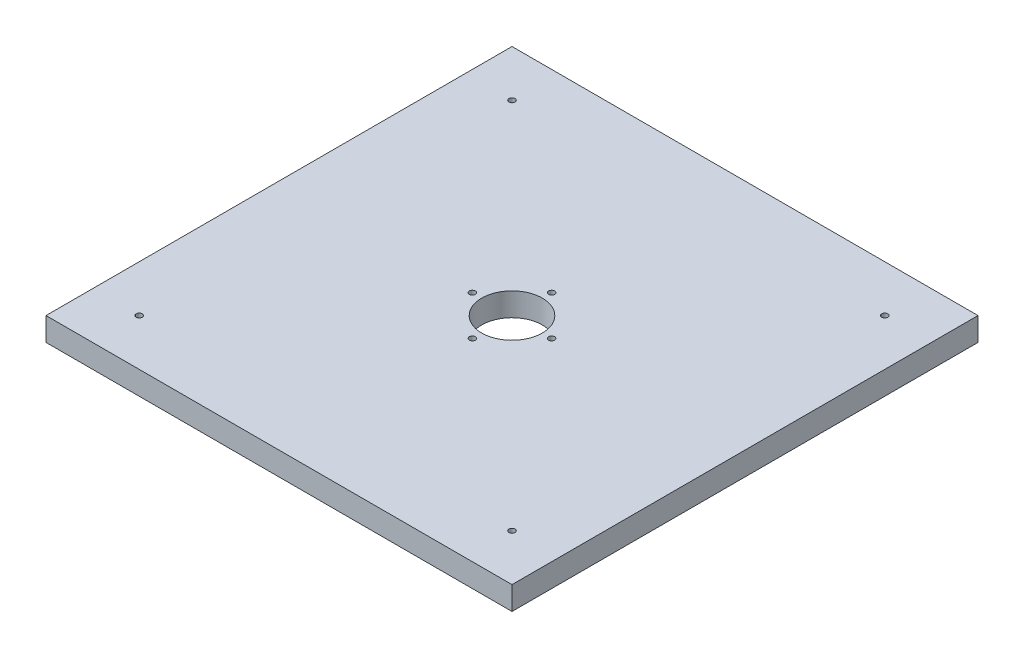
ISO-10303-21;
HEADER;
FILE_DESCRIPTION(('STEP AP214'),'2;1');
FILE_NAME('part.step','',(''),(''),'','','');
FILE_SCHEMA(('AUTOMOTIVE_DESIGN { 1 0 10303 214 1 1 1 1 }'));
ENDSEC;
DATA;
#1=APPLICATION_CONTEXT('core data for automotive mechanical design processes');
#2=APPLICATION_PROTOCOL_DEFINITION('international standard','automotive_design',2000,#1);
#3=PRODUCT_CONTEXT('',#1,'mechanical');
#4=PRODUCT('Part','Part','',(#3));
#5=PRODUCT_RELATED_PRODUCT_CATEGORY('part','',(#4));
#6=PRODUCT_DEFINITION_FORMATION('','',#4);
#7=PRODUCT_DEFINITION_CONTEXT('part definition',#1,'design');
#8=PRODUCT_DEFINITION('design','',#6,#7);
#9=PRODUCT_DEFINITION_SHAPE('','',#8);
#10=(LENGTH_UNIT() NAMED_UNIT(*) SI_UNIT(.MILLI.,.METRE.));
#11=(NAMED_UNIT(*) PLANE_ANGLE_UNIT() SI_UNIT($,.RADIAN.));
#12=(NAMED_UNIT(*) SI_UNIT($,.STERADIAN.) SOLID_ANGLE_UNIT());
#13=UNCERTAINTY_MEASURE_WITH_UNIT(LENGTH_MEASURE(1.E-05),#10,'distance_accuracy_value','');
#14=(GEOMETRIC_REPRESENTATION_CONTEXT(3) GLOBAL_UNCERTAINTY_ASSIGNED_CONTEXT((#13)) GLOBAL_UNIT_ASSIGNED_CONTEXT((#10,
#11,#12)) REPRESENTATION_CONTEXT('',''));
#15=CARTESIAN_POINT('',(0.,0.,0.));
#16=DIRECTION('',(0.,0.,1.));
#17=DIRECTION('',(1.,0.,0.));
#18=AXIS2_PLACEMENT_3D('',#15,#16,#17);
#19=CARTESIAN_POINT('',(0.,10.,0.));
#20=DIRECTION('',(0.,-1.,0.));
#21=DIRECTION('',(0.,0.,-1.));
#22=AXIS2_PLACEMENT_3D('',#19,#20,#21);
#23=PLANE('',#22);
#24=CARTESIAN_POINT('',(20.,10.,-180.));
#25=DIRECTION('',(0.,1.,0.));
#26=DIRECTION('',(0.,0.,1.));
#27=AXIS2_PLACEMENT_3D('',#24,#25,#26);
#28=CIRCLE('',#27,1.29999999999999);
#29=CARTESIAN_POINT('',(20.,10.,-178.7));
#30=VERTEX_POINT('',#29);
#31=EDGE_CURVE('E205',#30,#30,#28,.T.);
#32=ORIENTED_EDGE('',*,*,#31,.F.);
#33=EDGE_LOOP('',(#32));
#34=FACE_BOUND('',#33,.T.);
#35=CARTESIAN_POINT('',(180.,10.,-180.));
#36=DIRECTION('',(0.,1.,0.));
#37=DIRECTION('',(0.,0.,1.));
#38=AXIS2_PLACEMENT_3D('',#35,#36,#37);
#39=CIRCLE('',#38,1.3);
#40=CARTESIAN_POINT('',(180.,10.,-178.7));
#41=VERTEX_POINT('',#40);
#42=EDGE_CURVE('E197',#41,#41,#39,.T.);
#43=ORIENTED_EDGE('',*,*,#42,.F.);
#44=EDGE_LOOP('',(#43));
#45=FACE_BOUND('',#44,.T.);
#46=CARTESIAN_POINT('',(180.,10.,-20.));
#47=DIRECTION('',(0.,1.,0.));
#48=DIRECTION('',(0.,0.,1.));
#49=AXIS2_PLACEMENT_3D('',#46,#47,#48);
#50=CIRCLE('',#49,1.3);
#51=CARTESIAN_POINT('',(180.,10.,-18.7));
#52=VERTEX_POINT('',#51);
#53=EDGE_CURVE('E189',#52,#52,#50,.T.);
#54=ORIENTED_EDGE('',*,*,#53,.F.);
#55=EDGE_LOOP('',(#54));
#56=FACE_BOUND('',#55,.T.);
#57=CARTESIAN_POINT('',(20.,10.,-20.));
#58=DIRECTION('',(0.,1.,0.));
#59=DIRECTION('',(0.,0.,1.));
#60=AXIS2_PLACEMENT_3D('',#57,#58,#59);
#61=CIRCLE('',#60,1.29999999999999);
#62=CARTESIAN_POINT('',(20.,10.,-18.7));
#63=VERTEX_POINT('',#62);
#64=EDGE_CURVE('E181',#63,#63,#61,.T.);
#65=ORIENTED_EDGE('',*,*,#64,.F.);
#66=EDGE_LOOP('',(#65));
#67=FACE_BOUND('',#66,.T.);
#68=CARTESIAN_POINT('',(100.,10.,-117.));
#69=DIRECTION('',(0.,1.,0.));
#70=DIRECTION('',(0.,0.,1.));
#71=AXIS2_PLACEMENT_3D('',#68,#69,#70);
#72=CIRCLE('',#71,1.3);
#73=CARTESIAN_POINT('',(100.,10.,-115.7));
#74=VERTEX_POINT('',#73);
#75=EDGE_CURVE('E173',#74,#74,#72,.T.);
#76=ORIENTED_EDGE('',*,*,#75,.F.);
#77=EDGE_LOOP('',(#76));
#78=FACE_BOUND('',#77,.T.);
#79=CARTESIAN_POINT('',(117.,10.,-100.));
#80=DIRECTION('',(0.,1.,0.));
#81=DIRECTION('',(0.,0.,1.));
#82=AXIS2_PLACEMENT_3D('',#79,#80,#81);
#83=CIRCLE('',#82,1.29999999999998);
#84=CARTESIAN_POINT('',(117.,10.,-98.7));
#85=VERTEX_POINT('',#84);
#86=EDGE_CURVE('E165',#85,#85,#83,.T.);
#87=ORIENTED_EDGE('',*,*,#86,.F.);
#88=EDGE_LOOP('',(#87));
#89=FACE_BOUND('',#88,.T.);
#90=CARTESIAN_POINT('',(100.,10.,-83.));
#91=DIRECTION('',(0.,1.,0.));
#92=DIRECTION('',(0.,0.,1.));
#93=AXIS2_PLACEMENT_3D('',#90,#91,#92);
#94=CIRCLE('',#93,1.3);
#95=CARTESIAN_POINT('',(100.,10.,-81.7));
#96=VERTEX_POINT('',#95);
#97=EDGE_CURVE('E157',#96,#96,#94,.T.);
#98=ORIENTED_EDGE('',*,*,#97,.F.);
#99=EDGE_LOOP('',(#98));
#100=FACE_BOUND('',#99,.T.);
#101=CARTESIAN_POINT('',(100.,10.,-100.));
#102=DIRECTION('',(0.,1.,0.));
#103=DIRECTION('',(0.,0.,1.));
#104=AXIS2_PLACEMENT_3D('',#101,#102,#103);
#105=CIRCLE('',#104,13.);
#106=CARTESIAN_POINT('',(100.,10.,-87.));
#107=VERTEX_POINT('',#106);
#108=EDGE_CURVE('E141',#107,#107,#105,.T.);
#109=ORIENTED_EDGE('',*,*,#108,.F.);
#110=EDGE_LOOP('',(#109));
#111=FACE_BOUND('',#110,.T.);
#112=DIRECTION('',(0.,0.,1.));
#113=VECTOR('',#112,1.);
#114=CARTESIAN_POINT('',(0.,10.,0.));
#115=LINE('',#114,#113);
#116=CARTESIAN_POINT('',(0.,10.,-200.));
#117=VERTEX_POINT('',#116);
#118=CARTESIAN_POINT('',(0.,10.,0.));
#119=VERTEX_POINT('',#118);
#120=EDGE_CURVE('E98',#117,#119,#115,.T.);
#121=ORIENTED_EDGE('',*,*,#120,.T.);
#122=DIRECTION('',(1.,0.,0.));
#123=VECTOR('',#122,1.);
#124=CARTESIAN_POINT('',(0.,10.,0.));
#125=LINE('',#124,#123);
#126=CARTESIAN_POINT('',(200.,10.,0.));
#127=VERTEX_POINT('',#126);
#128=EDGE_CURVE('E93',#119,#127,#125,.T.);
#129=ORIENTED_EDGE('',*,*,#128,.T.);
#130=DIRECTION('',(0.,0.,-1.));
#131=VECTOR('',#130,1.);
#132=CARTESIAN_POINT('',(200.,10.,0.));
#133=LINE('',#132,#131);
#134=CARTESIAN_POINT('',(200.,10.,-200.));
#135=VERTEX_POINT('',#134);
#136=EDGE_CURVE('E96',#127,#135,#133,.T.);
#137=ORIENTED_EDGE('',*,*,#136,.T.);
#138=DIRECTION('',(-1.,0.,0.));
#139=VECTOR('',#138,1.);
#140=CARTESIAN_POINT('',(0.,10.,-200.));
#141=LINE('',#140,#139);
#142=EDGE_CURVE('E63',#135,#117,#141,.T.);
#143=ORIENTED_EDGE('',*,*,#142,.T.);
#144=EDGE_LOOP('',(#121,#129,#137,#143));
#145=FACE_BOUND('',#144,.T.);
#146=CARTESIAN_POINT('',(83.,10.,-100.));
#147=DIRECTION('',(0.,1.,0.));
#148=DIRECTION('',(0.,0.,1.));
#149=AXIS2_PLACEMENT_3D('',#146,#147,#148);
#150=CIRCLE('',#149,1.29999999999998);
#151=CARTESIAN_POINT('',(83.,10.,-98.7));
#152=VERTEX_POINT('',#151);
#153=EDGE_CURVE('E149',#152,#152,#150,.T.);
#154=ORIENTED_EDGE('',*,*,#153,.F.);
#155=EDGE_LOOP('',(#154));
#156=FACE_BOUND('',#155,.T.);
#157=ADVANCED_FACE('F44',(#34,#45,#56,#67,#78,#89,#100,#111,#145,#156),#23,.F.);
#158=CARTESIAN_POINT('',(0.,10.,0.));
#159=DIRECTION('',(1.,0.,0.));
#160=DIRECTION('',(0.,0.,-1.));
#161=AXIS2_PLACEMENT_3D('',#158,#159,#160);
#162=PLANE('',#161);
#163=DIRECTION('',(0.,0.,1.));
#164=VECTOR('',#163,1.);
#165=CARTESIAN_POINT('',(0.,0.,0.));
#166=LINE('',#165,#164);
#167=CARTESIAN_POINT('',(0.,0.,-200.));
#168=VERTEX_POINT('',#167);
#169=CARTESIAN_POINT('',(0.,0.,0.));
#170=VERTEX_POINT('',#169);
#171=EDGE_CURVE('E117',#168,#170,#166,.T.);
#172=ORIENTED_EDGE('',*,*,#171,.T.);
#173=DIRECTION('',(0.,-1.,0.));
#174=VECTOR('',#173,1.);
#175=CARTESIAN_POINT('',(0.,10.,0.));
#176=LINE('',#175,#174);
#177=EDGE_CURVE('E11',#119,#170,#176,.T.);
#178=ORIENTED_EDGE('',*,*,#177,.F.);
#179=ORIENTED_EDGE('',*,*,#120,.F.);
#180=DIRECTION('',(0.,-1.,0.));
#181=VECTOR('',#180,1.);
#182=CARTESIAN_POINT('',(0.,10.,-200.));
#183=LINE('',#182,#181);
#184=EDGE_CURVE('E113',#117,#168,#183,.T.);
#185=ORIENTED_EDGE('',*,*,#184,.T.);
#186=EDGE_LOOP('',(#172,#178,#179,#185));
#187=FACE_BOUND('',#186,.T.);
#188=ADVANCED_FACE('F46',(#187),#162,.F.);
#189=CARTESIAN_POINT('',(0.,10.,0.));
#190=DIRECTION('',(0.,0.,-1.));
#191=DIRECTION('',(-1.,0.,0.));
#192=AXIS2_PLACEMENT_3D('',#189,#190,#191);
#193=PLANE('',#192);
#194=DIRECTION('',(1.,0.,0.));
#195=VECTOR('',#194,1.);
#196=CARTESIAN_POINT('',(0.,0.,0.));
#197=LINE('',#196,#195);
#198=CARTESIAN_POINT('',(200.,0.,0.));
#199=VERTEX_POINT('',#198);
#200=EDGE_CURVE('E103',#170,#199,#197,.T.);
#201=ORIENTED_EDGE('',*,*,#200,.T.);
#202=DIRECTION('',(0.,-1.,0.));
#203=VECTOR('',#202,1.);
#204=CARTESIAN_POINT('',(200.,10.,0.));
#205=LINE('',#204,#203);
#206=EDGE_CURVE('E55',#127,#199,#205,.T.);
#207=ORIENTED_EDGE('',*,*,#206,.F.);
#208=ORIENTED_EDGE('',*,*,#128,.F.);
#209=ORIENTED_EDGE('',*,*,#177,.T.);
#210=EDGE_LOOP('',(#201,#207,#208,#209));
#211=FACE_BOUND('',#210,.T.);
#212=ADVANCED_FACE('F102',(#211),#193,.F.);
#213=CARTESIAN_POINT('',(200.,10.,0.));
#214=DIRECTION('',(-1.,0.,0.));
#215=DIRECTION('',(0.,0.,1.));
#216=AXIS2_PLACEMENT_3D('',#213,#214,#215);
#217=PLANE('',#216);
#218=DIRECTION('',(0.,0.,-1.));
#219=VECTOR('',#218,1.);
#220=CARTESIAN_POINT('',(200.,0.,0.));
#221=LINE('',#220,#219);
#222=CARTESIAN_POINT('',(200.,0.,-200.));
#223=VERTEX_POINT('',#222);
#224=EDGE_CURVE('E80',#199,#223,#221,.T.);
#225=ORIENTED_EDGE('',*,*,#224,.T.);
#226=DIRECTION('',(0.,-1.,0.));
#227=VECTOR('',#226,1.);
#228=CARTESIAN_POINT('',(200.,10.,-200.));
#229=LINE('',#228,#227);
#230=EDGE_CURVE('E105',#135,#223,#229,.T.);
#231=ORIENTED_EDGE('',*,*,#230,.F.);
#232=ORIENTED_EDGE('',*,*,#136,.F.);
#233=ORIENTED_EDGE('',*,*,#206,.T.);
#234=EDGE_LOOP('',(#225,#231,#232,#233));
#235=FACE_BOUND('',#234,.T.);
#236=ADVANCED_FACE('F107',(#235),#217,.F.);
#237=CARTESIAN_POINT('',(0.,10.,-200.));
#238=DIRECTION('',(0.,0.,1.));
#239=DIRECTION('',(1.,0.,0.));
#240=AXIS2_PLACEMENT_3D('',#237,#238,#239);
#241=PLANE('',#240);
#242=DIRECTION('',(-1.,0.,0.));
#243=VECTOR('',#242,1.);
#244=CARTESIAN_POINT('',(0.,0.,-200.));
#245=LINE('',#244,#243);
#246=EDGE_CURVE('E86',#223,#168,#245,.T.);
#247=ORIENTED_EDGE('',*,*,#246,.T.);
#248=ORIENTED_EDGE('',*,*,#184,.F.);
#249=ORIENTED_EDGE('',*,*,#142,.F.);
#250=ORIENTED_EDGE('',*,*,#230,.T.);
#251=EDGE_LOOP('',(#247,#248,#249,#250));
#252=FACE_BOUND('',#251,.T.);
#253=ADVANCED_FACE('F132',(#252),#241,.F.);
#254=CARTESIAN_POINT('',(0.,0.,0.));
#255=DIRECTION('',(0.,-1.,0.));
#256=DIRECTION('',(0.,0.,-1.));
#257=AXIS2_PLACEMENT_3D('',#254,#255,#256);
#258=PLANE('',#257);
#259=CARTESIAN_POINT('',(20.,0.,-180.));
#260=DIRECTION('',(0.,1.,0.));
#261=DIRECTION('',(0.,0.,1.));
#262=AXIS2_PLACEMENT_3D('',#259,#260,#261);
#263=CIRCLE('',#262,1.29999999999999);
#264=CARTESIAN_POINT('',(20.,0.,-178.7));
#265=VERTEX_POINT('',#264);
#266=EDGE_CURVE('E201',#265,#265,#263,.T.);
#267=ORIENTED_EDGE('',*,*,#266,.T.);
#268=EDGE_LOOP('',(#267));
#269=FACE_BOUND('',#268,.T.);
#270=CARTESIAN_POINT('',(180.,0.,-180.));
#271=DIRECTION('',(0.,1.,0.));
#272=DIRECTION('',(0.,0.,1.));
#273=AXIS2_PLACEMENT_3D('',#270,#271,#272);
#274=CIRCLE('',#273,1.3);
#275=CARTESIAN_POINT('',(180.,0.,-178.7));
#276=VERTEX_POINT('',#275);
#277=EDGE_CURVE('E193',#276,#276,#274,.T.);
#278=ORIENTED_EDGE('',*,*,#277,.T.);
#279=EDGE_LOOP('',(#278));
#280=FACE_BOUND('',#279,.T.);
#281=CARTESIAN_POINT('',(180.,0.,-20.));
#282=DIRECTION('',(0.,1.,0.));
#283=DIRECTION('',(0.,0.,1.));
#284=AXIS2_PLACEMENT_3D('',#281,#282,#283);
#285=CIRCLE('',#284,1.3);
#286=CARTESIAN_POINT('',(180.,0.,-18.7));
#287=VERTEX_POINT('',#286);
#288=EDGE_CURVE('E185',#287,#287,#285,.T.);
#289=ORIENTED_EDGE('',*,*,#288,.T.);
#290=EDGE_LOOP('',(#289));
#291=FACE_BOUND('',#290,.T.);
#292=CARTESIAN_POINT('',(20.,0.,-20.));
#293=DIRECTION('',(0.,1.,0.));
#294=DIRECTION('',(0.,0.,1.));
#295=AXIS2_PLACEMENT_3D('',#292,#293,#294);
#296=CIRCLE('',#295,1.29999999999999);
#297=CARTESIAN_POINT('',(20.,0.,-18.7));
#298=VERTEX_POINT('',#297);
#299=EDGE_CURVE('E177',#298,#298,#296,.T.);
#300=ORIENTED_EDGE('',*,*,#299,.T.);
#301=EDGE_LOOP('',(#300));
#302=FACE_BOUND('',#301,.T.);
#303=CARTESIAN_POINT('',(100.,0.,-117.));
#304=DIRECTION('',(0.,1.,0.));
#305=DIRECTION('',(0.,0.,1.));
#306=AXIS2_PLACEMENT_3D('',#303,#304,#305);
#307=CIRCLE('',#306,1.29999999999998);
#308=CARTESIAN_POINT('',(100.,0.,-115.7));
#309=VERTEX_POINT('',#308);
#310=EDGE_CURVE('E169',#309,#309,#307,.T.);
#311=ORIENTED_EDGE('',*,*,#310,.T.);
#312=EDGE_LOOP('',(#311));
#313=FACE_BOUND('',#312,.T.);
#314=CARTESIAN_POINT('',(117.,0.,-100.));
#315=DIRECTION('',(0.,1.,0.));
#316=DIRECTION('',(0.,0.,1.));
#317=AXIS2_PLACEMENT_3D('',#314,#315,#316);
#318=CIRCLE('',#317,1.29999999999998);
#319=CARTESIAN_POINT('',(117.,0.,-98.7));
#320=VERTEX_POINT('',#319);
#321=EDGE_CURVE('E161',#320,#320,#318,.T.);
#322=ORIENTED_EDGE('',*,*,#321,.T.);
#323=EDGE_LOOP('',(#322));
#324=FACE_BOUND('',#323,.T.);
#325=CARTESIAN_POINT('',(100.,0.,-83.));
#326=DIRECTION('',(0.,1.,0.));
#327=DIRECTION('',(0.,0.,1.));
#328=AXIS2_PLACEMENT_3D('',#325,#326,#327);
#329=CIRCLE('',#328,1.29999999999998);
#330=CARTESIAN_POINT('',(100.,0.,-81.7));
#331=VERTEX_POINT('',#330);
#332=EDGE_CURVE('E153',#331,#331,#329,.T.);
#333=ORIENTED_EDGE('',*,*,#332,.T.);
#334=EDGE_LOOP('',(#333));
#335=FACE_BOUND('',#334,.T.);
#336=CARTESIAN_POINT('',(83.,0.,-100.));
#337=DIRECTION('',(0.,1.,0.));
#338=DIRECTION('',(0.,0.,1.));
#339=AXIS2_PLACEMENT_3D('',#336,#337,#338);
#340=CIRCLE('',#339,1.29999999999998);
#341=CARTESIAN_POINT('',(83.,0.,-98.7));
#342=VERTEX_POINT('',#341);
#343=EDGE_CURVE('E145',#342,#342,#340,.T.);
#344=ORIENTED_EDGE('',*,*,#343,.T.);
#345=EDGE_LOOP('',(#344));
#346=FACE_BOUND('',#345,.T.);
#347=CARTESIAN_POINT('',(100.,0.,-100.));
#348=DIRECTION('',(0.,-1.,0.));
#349=DIRECTION('',(0.,0.,-1.));
#350=AXIS2_PLACEMENT_3D('',#347,#348,#349);
#351=CIRCLE('',#350,13.);
#352=CARTESIAN_POINT('',(100.,0.,-87.));
#353=VERTEX_POINT('',#352);
#354=EDGE_CURVE('E48',#353,#353,#351,.T.);
#355=ORIENTED_EDGE('',*,*,#354,.F.);
#356=EDGE_LOOP('',(#355));
#357=FACE_BOUND('',#356,.T.);
#358=ORIENTED_EDGE('',*,*,#171,.F.);
#359=ORIENTED_EDGE('',*,*,#246,.F.);
#360=ORIENTED_EDGE('',*,*,#224,.F.);
#361=ORIENTED_EDGE('',*,*,#200,.F.);
#362=EDGE_LOOP('',(#358,#359,#360,#361));
#363=FACE_BOUND('',#362,.T.);
#364=ADVANCED_FACE('F135',(#269,#280,#291,#302,#313,#324,#335,#346,#357,#363),#258,.T.);
#365=CARTESIAN_POINT('',(100.,-1.2E-05,-100.));
#366=DIRECTION('',(0.,1.,0.));
#367=DIRECTION('',(0.,0.,1.));
#368=AXIS2_PLACEMENT_3D('',#365,#366,#367);
#369=CYLINDRICAL_SURFACE('',#368,13.);
#370=CARTESIAN_POINT('',(100.,0.,-87.));
#371=CARTESIAN_POINT('',(100.,0.104166666666667,-87.));
#372=CARTESIAN_POINT('',(100.,0.208333333333333,-87.));
#373=CARTESIAN_POINT('',(100.,0.416666666666667,-87.));
#374=CARTESIAN_POINT('',(100.,0.520833333333333,-87.));
#375=CARTESIAN_POINT('',(100.,0.729166666666667,-87.));
#376=CARTESIAN_POINT('',(100.,0.833333333333333,-87.));
#377=CARTESIAN_POINT('',(100.,1.04166666666667,-87.));
#378=CARTESIAN_POINT('',(100.,1.14583333333333,-87.));
#379=CARTESIAN_POINT('',(100.,1.35416666666667,-87.));
#380=CARTESIAN_POINT('',(100.,1.45833333333333,-87.));
#381=CARTESIAN_POINT('',(100.,1.66666666666667,-87.));
#382=CARTESIAN_POINT('',(100.,1.77083333333333,-87.));
#383=CARTESIAN_POINT('',(100.,1.97916666666667,-87.));
#384=CARTESIAN_POINT('',(100.,2.08333333333333,-87.));
#385=CARTESIAN_POINT('',(100.,2.29166666666667,-87.));
#386=CARTESIAN_POINT('',(100.,2.39583333333333,-87.));
#387=CARTESIAN_POINT('',(100.,2.60416666666667,-87.));
#388=CARTESIAN_POINT('',(100.,2.70833333333333,-87.));
#389=CARTESIAN_POINT('',(100.,2.91666666666667,-87.));
#390=CARTESIAN_POINT('',(100.,3.02083333333333,-87.));
#391=CARTESIAN_POINT('',(100.,3.22916666666667,-87.));
#392=CARTESIAN_POINT('',(100.,3.33333333333333,-87.));
#393=CARTESIAN_POINT('',(100.,3.54166666666667,-87.));
#394=CARTESIAN_POINT('',(100.,3.64583333333333,-87.));
#395=CARTESIAN_POINT('',(100.,3.85416666666667,-87.));
#396=CARTESIAN_POINT('',(100.,3.95833333333333,-87.));
#397=CARTESIAN_POINT('',(100.,4.16666666666667,-87.));
#398=CARTESIAN_POINT('',(100.,4.27083333333333,-87.));
#399=CARTESIAN_POINT('',(100.,4.47916666666667,-87.));
#400=CARTESIAN_POINT('',(100.,4.58333333333333,-87.));
#401=CARTESIAN_POINT('',(100.,4.79166666666667,-87.));
#402=CARTESIAN_POINT('',(100.,4.89583333333333,-87.));
#403=CARTESIAN_POINT('',(100.,5.10416666666667,-87.));
#404=CARTESIAN_POINT('',(100.,5.20833333333333,-87.));
#405=CARTESIAN_POINT('',(100.,5.41666666666667,-87.));
#406=CARTESIAN_POINT('',(100.,5.52083333333333,-87.));
#407=CARTESIAN_POINT('',(100.,5.72916666666667,-87.));
#408=CARTESIAN_POINT('',(100.,5.83333333333333,-87.));
#409=CARTESIAN_POINT('',(100.,6.04166666666667,-87.));
#410=CARTESIAN_POINT('',(100.,6.14583333333333,-87.));
#411=CARTESIAN_POINT('',(100.,6.35416666666667,-87.));
#412=CARTESIAN_POINT('',(100.,6.45833333333333,-87.));
#413=CARTESIAN_POINT('',(100.,6.66666666666667,-87.));
#414=CARTESIAN_POINT('',(100.,6.77083333333333,-87.));
#415=CARTESIAN_POINT('',(100.,6.97916666666667,-87.));
#416=CARTESIAN_POINT('',(100.,7.08333333333333,-87.));
#417=CARTESIAN_POINT('',(100.,7.29166666666667,-87.));
#418=CARTESIAN_POINT('',(100.,7.39583333333333,-87.));
#419=CARTESIAN_POINT('',(100.,7.60416666666667,-87.));
#420=CARTESIAN_POINT('',(100.,7.70833333333333,-87.));
#421=CARTESIAN_POINT('',(100.,7.91666666666667,-87.));
#422=CARTESIAN_POINT('',(100.,8.02083333333333,-87.));
#423=CARTESIAN_POINT('',(100.,8.22916666666667,-87.));
#424=CARTESIAN_POINT('',(100.,8.33333333333333,-87.));
#425=CARTESIAN_POINT('',(100.,8.54166666666667,-87.));
#426=CARTESIAN_POINT('',(100.,8.64583333333333,-87.));
#427=CARTESIAN_POINT('',(100.,8.85416666666667,-87.));
#428=CARTESIAN_POINT('',(100.,8.95833333333333,-87.));
#429=CARTESIAN_POINT('',(100.,9.16666666666667,-87.));
#430=CARTESIAN_POINT('',(100.,9.27083333333333,-87.));
#431=CARTESIAN_POINT('',(100.,9.47916666666667,-87.));
#432=CARTESIAN_POINT('',(100.,9.58333333333333,-87.));
#433=CARTESIAN_POINT('',(100.,9.79166666666667,-87.));
#434=CARTESIAN_POINT('',(100.,9.89583333333333,-87.));
#435=CARTESIAN_POINT('',(100.,10.,-87.));
#436=B_SPLINE_CURVE_WITH_KNOTS('',3,(#370,#371,#372,#373,#374,#375,#376,#377,#378,#379,#380,
#381,#382,#383,#384,#385,#386,#387,#388,#389,#390,#391,#392,#393,#394,#395,#396,#397,#398,#399,
#400,#401,#402,#403,#404,#405,#406,#407,#408,#409,#410,#411,#412,#413,#414,#415,#416,#417,#418,
#419,#420,#421,#422,#423,#424,#425,#426,#427,#428,#429,#430,#431,#432,#433,#434,#435),
.UNSPECIFIED.,.F.,.F.,(4,2,2,2,2,2,2,2,2,2,2,2,2,2,2,2,2,2,2,2,2,2,2,2,2,2,2,2,2,2,2,2,4),(0.,
0.3125,0.625,0.9375,1.25,1.5625,1.875,2.1875,2.5,2.8125,3.125,3.4375,3.75,4.0625,4.375,4.6875,
5.,5.3125,5.625,5.9375,6.25,6.5625,6.875,7.1875,7.5,7.8125,8.125,8.4375,8.75,9.0625,9.375,
9.6875,10.),.UNSPECIFIED.);
#437=EDGE_CURVE('BSEAM231',#353,#107,#436,.T.);
#438=ORIENTED_EDGE('',*,*,#354,.T.);
#439=ORIENTED_EDGE('',*,*,#108,.T.);
#440=ORIENTED_EDGE('',*,*,#437,.T.);
#441=ORIENTED_EDGE('',*,*,#437,.F.);
#442=EDGE_LOOP('',(#438,#440,#439,#441));
#443=FACE_BOUND('',#442,.T.);
#444=ADVANCED_FACE('F231',(#443),#369,.F.);
#445=CARTESIAN_POINT('',(83.,10.,-100.));
#446=DIRECTION('',(0.,1.,0.));
#447=DIRECTION('',(0.,0.,1.));
#448=AXIS2_PLACEMENT_3D('',#445,#446,#447);
#449=CYLINDRICAL_SURFACE('',#448,1.29999999999998);
#450=ORIENTED_EDGE('',*,*,#343,.F.);
#451=EDGE_LOOP('',(#450));
#452=FACE_BOUND('',#451,.T.);
#453=ORIENTED_EDGE('',*,*,#153,.T.);
#454=EDGE_LOOP('',(#453));
#455=FACE_BOUND('',#454,.T.);
#456=ADVANCED_FACE('F233',(#452,#455),#449,.F.);
#457=CARTESIAN_POINT('',(100.,10.,-83.));
#458=DIRECTION('',(0.,1.,0.));
#459=DIRECTION('',(0.,0.,1.));
#460=AXIS2_PLACEMENT_3D('',#457,#458,#459);
#461=CYLINDRICAL_SURFACE('',#460,1.29999999999999);
#462=ORIENTED_EDGE('',*,*,#332,.F.);
#463=EDGE_LOOP('',(#462));
#464=FACE_BOUND('',#463,.T.);
#465=ORIENTED_EDGE('',*,*,#97,.T.);
#466=EDGE_LOOP('',(#465));
#467=FACE_BOUND('',#466,.T.);
#468=ADVANCED_FACE('F240',(#464,#467),#461,.F.);
#469=CARTESIAN_POINT('',(117.,10.,-100.));
#470=DIRECTION('',(0.,1.,0.));
#471=DIRECTION('',(0.,0.,1.));
#472=AXIS2_PLACEMENT_3D('',#469,#470,#471);
#473=CYLINDRICAL_SURFACE('',#472,1.29999999999998);
#474=ORIENTED_EDGE('',*,*,#321,.F.);
#475=EDGE_LOOP('',(#474));
#476=FACE_BOUND('',#475,.T.);
#477=ORIENTED_EDGE('',*,*,#86,.T.);
#478=EDGE_LOOP('',(#477));
#479=FACE_BOUND('',#478,.T.);
#480=ADVANCED_FACE('F289',(#476,#479),#473,.F.);
#481=CARTESIAN_POINT('',(100.,10.,-117.));
#482=DIRECTION('',(0.,1.,0.));
#483=DIRECTION('',(0.,0.,1.));
#484=AXIS2_PLACEMENT_3D('',#481,#482,#483);
#485=CYLINDRICAL_SURFACE('',#484,1.29999999999999);
#486=ORIENTED_EDGE('',*,*,#310,.F.);
#487=EDGE_LOOP('',(#486));
#488=FACE_BOUND('',#487,.T.);
#489=ORIENTED_EDGE('',*,*,#75,.T.);
#490=EDGE_LOOP('',(#489));
#491=FACE_BOUND('',#490,.T.);
#492=ADVANCED_FACE('F299',(#488,#491),#485,.F.);
#493=CARTESIAN_POINT('',(20.,10.,-20.));
#494=DIRECTION('',(0.,1.,0.));
#495=DIRECTION('',(0.,0.,1.));
#496=AXIS2_PLACEMENT_3D('',#493,#494,#495);
#497=CYLINDRICAL_SURFACE('',#496,1.29999999999999);
#498=ORIENTED_EDGE('',*,*,#299,.F.);
#499=EDGE_LOOP('',(#498));
#500=FACE_BOUND('',#499,.T.);
#501=ORIENTED_EDGE('',*,*,#64,.T.);
#502=EDGE_LOOP('',(#501));
#503=FACE_BOUND('',#502,.T.);
#504=ADVANCED_FACE('F310',(#500,#503),#497,.F.);
#505=CARTESIAN_POINT('',(180.,10.,-20.));
#506=DIRECTION('',(0.,1.,0.));
#507=DIRECTION('',(0.,0.,1.));
#508=AXIS2_PLACEMENT_3D('',#505,#506,#507);
#509=CYLINDRICAL_SURFACE('',#508,1.3);
#510=ORIENTED_EDGE('',*,*,#288,.F.);
#511=EDGE_LOOP('',(#510));
#512=FACE_BOUND('',#511,.T.);
#513=ORIENTED_EDGE('',*,*,#53,.T.);
#514=EDGE_LOOP('',(#513));
#515=FACE_BOUND('',#514,.T.);
#516=ADVANCED_FACE('F321',(#512,#515),#509,.F.);
#517=CARTESIAN_POINT('',(180.,10.,-180.));
#518=DIRECTION('',(0.,1.,0.));
#519=DIRECTION('',(0.,0.,1.));
#520=AXIS2_PLACEMENT_3D('',#517,#518,#519);
#521=CYLINDRICAL_SURFACE('',#520,1.3);
#522=ORIENTED_EDGE('',*,*,#277,.F.);
#523=EDGE_LOOP('',(#522));
#524=FACE_BOUND('',#523,.T.);
#525=ORIENTED_EDGE('',*,*,#42,.T.);
#526=EDGE_LOOP('',(#525));
#527=FACE_BOUND('',#526,.T.);
#528=ADVANCED_FACE('F332',(#524,#527),#521,.F.);
#529=CARTESIAN_POINT('',(20.,10.,-180.));
#530=DIRECTION('',(0.,1.,0.));
#531=DIRECTION('',(0.,0.,1.));
#532=AXIS2_PLACEMENT_3D('',#529,#530,#531);
#533=CYLINDRICAL_SURFACE('',#532,1.29999999999999);
#534=ORIENTED_EDGE('',*,*,#266,.F.);
#535=EDGE_LOOP('',(#534));
#536=FACE_BOUND('',#535,.T.);
#537=ORIENTED_EDGE('',*,*,#31,.T.);
#538=EDGE_LOOP('',(#537));
#539=FACE_BOUND('',#538,.T.);
#540=ADVANCED_FACE('F212',(#536,#539),#533,.F.);
#541=CLOSED_SHELL('',(#157,#188,#212,#236,#253,#364,#444,#456,#468,#480,#492,#504,#516,#528,#540));
#542=MANIFOLD_SOLID_BREP('B2',#541);
#543=ADVANCED_BREP_SHAPE_REPRESENTATION('',(#18,#542),#14);
#544=SHAPE_DEFINITION_REPRESENTATION(#9,#543);
ENDSEC;
END-ISO-10303-21;
